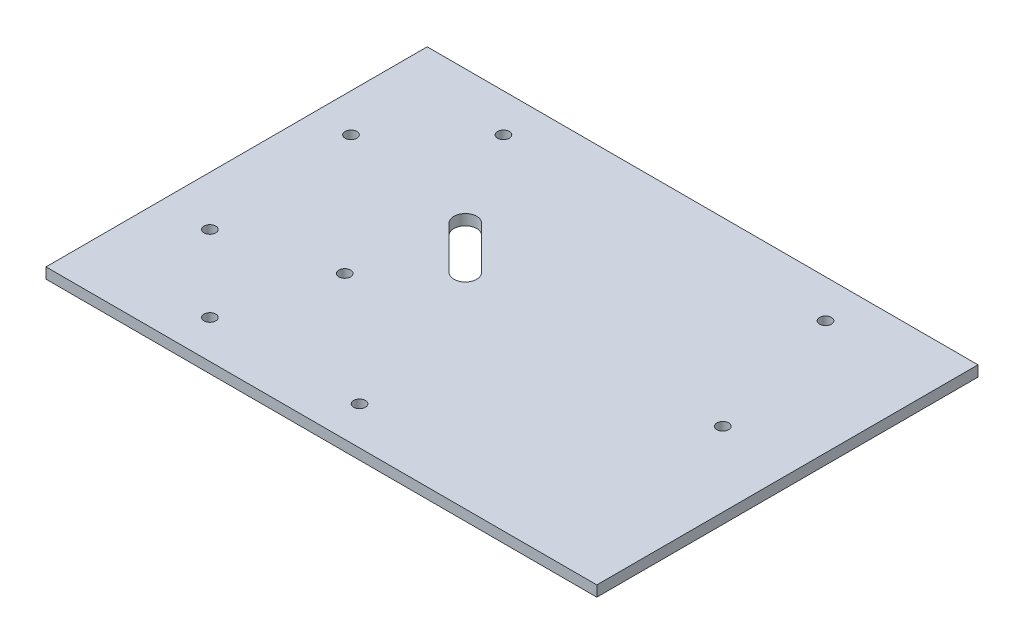
ISO-10303-21;
HEADER;
FILE_DESCRIPTION(('STEP AP214'),'2;1');
FILE_NAME('part.step','',(''),(''),'','','');
FILE_SCHEMA(('AUTOMOTIVE_DESIGN { 1 0 10303 214 1 1 1 1 }'));
ENDSEC;
DATA;
#1=APPLICATION_CONTEXT('core data for automotive mechanical design processes');
#2=APPLICATION_PROTOCOL_DEFINITION('international standard','automotive_design',2000,#1);
#3=PRODUCT_CONTEXT('',#1,'mechanical');
#4=PRODUCT('Part','Part','',(#3));
#5=PRODUCT_RELATED_PRODUCT_CATEGORY('part','',(#4));
#6=PRODUCT_DEFINITION_FORMATION('','',#4);
#7=PRODUCT_DEFINITION_CONTEXT('part definition',#1,'design');
#8=PRODUCT_DEFINITION('design','',#6,#7);
#9=PRODUCT_DEFINITION_SHAPE('','',#8);
#10=(LENGTH_UNIT() NAMED_UNIT(*) SI_UNIT(.MILLI.,.METRE.));
#11=(NAMED_UNIT(*) PLANE_ANGLE_UNIT() SI_UNIT($,.RADIAN.));
#12=(NAMED_UNIT(*) SI_UNIT($,.STERADIAN.) SOLID_ANGLE_UNIT());
#13=UNCERTAINTY_MEASURE_WITH_UNIT(LENGTH_MEASURE(1.E-05),#10,'distance_accuracy_value','');
#14=(GEOMETRIC_REPRESENTATION_CONTEXT(3) GLOBAL_UNCERTAINTY_ASSIGNED_CONTEXT((#13)) GLOBAL_UNIT_ASSIGNED_CONTEXT((#10,
#11,#12)) REPRESENTATION_CONTEXT('',''));
#15=CARTESIAN_POINT('',(0.,0.,0.));
#16=DIRECTION('',(0.,0.,1.));
#17=DIRECTION('',(1.,0.,0.));
#18=AXIS2_PLACEMENT_3D('',#15,#16,#17);
#19=CARTESIAN_POINT('',(0.,2.8,0.));
#20=DIRECTION('',(0.,-1.,0.));
#21=DIRECTION('',(0.,0.,-1.));
#22=AXIS2_PLACEMENT_3D('',#19,#20,#21);
#23=PLANE('',#22);
#24=CARTESIAN_POINT('',(52.75,2.8,-2.56000000000001));
#25=DIRECTION('',(0.,1.,0.));
#26=DIRECTION('',(0.,0.,1.));
#27=AXIS2_PLACEMENT_3D('',#24,#25,#26);
#28=CIRCLE('',#27,1.55);
#29=CARTESIAN_POINT('',(52.75,2.8,-1.01000000000001));
#30=VERTEX_POINT('',#29);
#31=EDGE_CURVE('E276',#30,#30,#28,.T.);
#32=ORIENTED_EDGE('',*,*,#31,.F.);
#33=EDGE_LOOP('',(#32));
#34=FACE_BOUND('',#33,.T.);
#35=CARTESIAN_POINT('',(-62.25,2.8,-20.));
#36=DIRECTION('',(0.,1.,0.));
#37=DIRECTION('',(0.,0.,1.));
#38=AXIS2_PLACEMENT_3D('',#35,#36,#37);
#39=CIRCLE('',#38,1.54999999999999);
#40=CARTESIAN_POINT('',(-62.25,2.8,-18.45));
#41=VERTEX_POINT('',#40);
#42=EDGE_CURVE('E284',#41,#41,#39,.T.);
#43=ORIENTED_EDGE('',*,*,#42,.F.);
#44=EDGE_LOOP('',(#43));
#45=FACE_BOUND('',#44,.T.);
#46=CARTESIAN_POINT('',(-42.25,2.8,-40.));
#47=DIRECTION('',(0.,1.,0.));
#48=DIRECTION('',(0.,0.,1.));
#49=AXIS2_PLACEMENT_3D('',#46,#47,#48);
#50=CIRCLE('',#49,1.55);
#51=CARTESIAN_POINT('',(-42.25,2.8,-38.45));
#52=VERTEX_POINT('',#51);
#53=EDGE_CURVE('E290',#52,#52,#50,.T.);
#54=ORIENTED_EDGE('',*,*,#53,.F.);
#55=EDGE_LOOP('',(#54));
#56=FACE_BOUND('',#55,.T.);
#57=CARTESIAN_POINT('',(42.25,2.8,-40.));
#58=DIRECTION('',(0.,1.,0.));
#59=DIRECTION('',(0.,0.,1.));
#60=AXIS2_PLACEMENT_3D('',#57,#58,#59);
#61=CIRCLE('',#60,1.55);
#62=CARTESIAN_POINT('',(42.25,2.8,-38.45));
#63=VERTEX_POINT('',#62);
#64=EDGE_CURVE('E296',#63,#63,#61,.T.);
#65=ORIENTED_EDGE('',*,*,#64,.F.);
#66=EDGE_LOOP('',(#65));
#67=FACE_BOUND('',#66,.T.);
#68=CARTESIAN_POINT('',(0.,2.8,40.));
#69=DIRECTION('',(0.,1.,0.));
#70=DIRECTION('',(0.,0.,1.));
#71=AXIS2_PLACEMENT_3D('',#68,#69,#70);
#72=CIRCLE('',#71,1.55);
#73=CARTESIAN_POINT('',(0.,2.8,41.55));
#74=VERTEX_POINT('',#73);
#75=EDGE_CURVE('E280',#74,#74,#72,.T.);
#76=ORIENTED_EDGE('',*,*,#75,.F.);
#77=EDGE_LOOP('',(#76));
#78=FACE_BOUND('',#77,.T.);
#79=DIRECTION('',(0.707106781186551,0.,0.707106781186544));
#80=VECTOR('',#79,1.);
#81=CARTESIAN_POINT('',(-29.3713203435596,2.8,-12.8786796564403));
#82=LINE('',#81,#80);
#83=CARTESIAN_POINT('',(-29.3713203435596,2.8,-12.8786796564403));
#84=VERTEX_POINT('',#83);
#85=CARTESIAN_POINT('',(-18.0576118445746,2.8,-1.56497115745581));
#86=VERTEX_POINT('',#85);
#87=EDGE_CURVE('E117',#84,#86,#82,.T.);
#88=ORIENTED_EDGE('',*,*,#87,.F.);
#89=CARTESIAN_POINT('',(-27.25,2.8,-15.));
#90=DIRECTION('',(0.,1.,0.));
#91=DIRECTION('',(0.,0.,1.));
#92=AXIS2_PLACEMENT_3D('',#89,#90,#91);
#93=CIRCLE('',#92,3.);
#94=CARTESIAN_POINT('',(-25.1286796564404,2.8,-17.1213203435596));
#95=VERTEX_POINT('',#94);
#96=EDGE_CURVE('E48',#95,#84,#93,.T.);
#97=ORIENTED_EDGE('',*,*,#96,.F.);
#98=DIRECTION('',(-0.707106781186551,0.,-0.707106781186544));
#99=VECTOR('',#98,1.);
#100=CARTESIAN_POINT('',(-25.1286796564404,2.8,-17.1213203435596));
#101=LINE('',#100,#99);
#102=CARTESIAN_POINT('',(-13.8149711574555,2.8,-5.80761184457495));
#103=VERTEX_POINT('',#102);
#104=EDGE_CURVE('E110',#103,#95,#101,.T.);
#105=ORIENTED_EDGE('',*,*,#104,.F.);
#106=CARTESIAN_POINT('',(-15.936291501015,2.8,-3.68629150101547));
#107=DIRECTION('',(0.,1.,0.));
#108=DIRECTION('',(0.,0.,1.));
#109=AXIS2_PLACEMENT_3D('',#106,#107,#108);
#110=CIRCLE('',#109,3.);
#111=EDGE_CURVE('E124',#86,#103,#110,.T.);
#112=ORIENTED_EDGE('',*,*,#111,.F.);
#113=EDGE_LOOP('',(#88,#97,#105,#112));
#114=FACE_BOUND('',#113,.T.);
#115=DIRECTION('',(0.,0.,-1.));
#116=VECTOR('',#115,1.);
#117=CARTESIAN_POINT('',(72.25,2.8,50.));
#118=LINE('',#117,#116);
#119=CARTESIAN_POINT('',(72.25,2.8,50.));
#120=VERTEX_POINT('',#119);
#121=CARTESIAN_POINT('',(72.25,2.8,-50.));
#122=VERTEX_POINT('',#121);
#123=EDGE_CURVE('E151',#120,#122,#118,.T.);
#124=ORIENTED_EDGE('',*,*,#123,.T.);
#125=DIRECTION('',(-1.,0.,0.));
#126=VECTOR('',#125,1.);
#127=CARTESIAN_POINT('',(-72.25,2.8,-50.));
#128=LINE('',#127,#126);
#129=CARTESIAN_POINT('',(-72.25,2.8,-50.));
#130=VERTEX_POINT('',#129);
#131=EDGE_CURVE('E154',#122,#130,#128,.T.);
#132=ORIENTED_EDGE('',*,*,#131,.T.);
#133=DIRECTION('',(0.,0.,1.));
#134=VECTOR('',#133,1.);
#135=CARTESIAN_POINT('',(-72.25,2.8,50.));
#136=LINE('',#135,#134);
#137=CARTESIAN_POINT('',(-72.25,2.8,50.));
#138=VERTEX_POINT('',#137);
#139=EDGE_CURVE('E157',#130,#138,#136,.T.);
#140=ORIENTED_EDGE('',*,*,#139,.T.);
#141=DIRECTION('',(1.,0.,0.));
#142=VECTOR('',#141,1.);
#143=CARTESIAN_POINT('',(-72.25,2.8,50.));
#144=LINE('',#143,#142);
#145=EDGE_CURVE('E159',#138,#120,#144,.T.);
#146=ORIENTED_EDGE('',*,*,#145,.T.);
#147=EDGE_LOOP('',(#124,#132,#140,#146));
#148=FACE_BOUND('',#147,.T.);
#149=CARTESIAN_POINT('',(-59.25,2.8,20.));
#150=DIRECTION('',(0.,1.,0.));
#151=DIRECTION('',(0.,0.,1.));
#152=AXIS2_PLACEMENT_3D('',#149,#150,#151);
#153=CIRCLE('',#152,1.55);
#154=CARTESIAN_POINT('',(-59.25,2.8,21.55));
#155=VERTEX_POINT('',#154);
#156=EDGE_CURVE('E145',#155,#155,#153,.T.);
#157=ORIENTED_EDGE('',*,*,#156,.F.);
#158=EDGE_LOOP('',(#157));
#159=FACE_BOUND('',#158,.T.);
#160=CARTESIAN_POINT('',(-39.25,2.8,40.));
#161=DIRECTION('',(0.,1.,0.));
#162=DIRECTION('',(0.,0.,1.));
#163=AXIS2_PLACEMENT_3D('',#160,#161,#162);
#164=CIRCLE('',#163,1.55);
#165=CARTESIAN_POINT('',(-39.25,2.8,41.55));
#166=VERTEX_POINT('',#165);
#167=EDGE_CURVE('E139',#166,#166,#164,.T.);
#168=ORIENTED_EDGE('',*,*,#167,.F.);
#169=EDGE_LOOP('',(#168));
#170=FACE_BOUND('',#169,.T.);
#171=CARTESIAN_POINT('',(-31.5723304703363,2.8,12.3223304703363));
#172=DIRECTION('',(0.,1.,0.));
#173=DIRECTION('',(0.,0.,1.));
#174=AXIS2_PLACEMENT_3D('',#171,#172,#173);
#175=CIRCLE('',#174,1.55);
#176=CARTESIAN_POINT('',(-31.5723304703363,2.8,13.8723304703363));
#177=VERTEX_POINT('',#176);
#178=EDGE_CURVE('E133',#177,#177,#175,.T.);
#179=ORIENTED_EDGE('',*,*,#178,.F.);
#180=EDGE_LOOP('',(#179));
#181=FACE_BOUND('',#180,.T.);
#182=ADVANCED_FACE('F33',(#34,#45,#56,#67,#78,#114,#148,#159,#170,#181),#23,.F.);
#183=CARTESIAN_POINT('',(0.,0.,0.));
#184=DIRECTION('',(0.,-1.,0.));
#185=DIRECTION('',(0.,0.,-1.));
#186=AXIS2_PLACEMENT_3D('',#183,#184,#185);
#187=PLANE('',#186);
#188=CARTESIAN_POINT('',(52.75,0.,-2.56000000000001));
#189=DIRECTION('',(0.,-1.,0.));
#190=DIRECTION('',(0.,0.,-1.));
#191=AXIS2_PLACEMENT_3D('',#188,#189,#190);
#192=CIRCLE('',#191,1.55);
#193=CARTESIAN_POINT('',(52.75,0.,-4.11000000000001));
#194=VERTEX_POINT('',#193);
#195=EDGE_CURVE('E274',#194,#194,#192,.F.);
#196=ORIENTED_EDGE('',*,*,#195,.T.);
#197=EDGE_LOOP('',(#196));
#198=FACE_BOUND('',#197,.T.);
#199=CARTESIAN_POINT('',(-62.25,0.,-20.));
#200=DIRECTION('',(0.,-1.,0.));
#201=DIRECTION('',(0.,0.,-1.));
#202=AXIS2_PLACEMENT_3D('',#199,#200,#201);
#203=CIRCLE('',#202,1.54999999999999);
#204=CARTESIAN_POINT('',(-62.25,0.,-21.55));
#205=VERTEX_POINT('',#204);
#206=EDGE_CURVE('E287',#205,#205,#203,.F.);
#207=ORIENTED_EDGE('',*,*,#206,.T.);
#208=EDGE_LOOP('',(#207));
#209=FACE_BOUND('',#208,.T.);
#210=CARTESIAN_POINT('',(-42.25,0.,-40.));
#211=DIRECTION('',(0.,-1.,0.));
#212=DIRECTION('',(0.,0.,-1.));
#213=AXIS2_PLACEMENT_3D('',#210,#211,#212);
#214=CIRCLE('',#213,1.55);
#215=CARTESIAN_POINT('',(-42.25,0.,-41.55));
#216=VERTEX_POINT('',#215);
#217=EDGE_CURVE('E293',#216,#216,#214,.F.);
#218=ORIENTED_EDGE('',*,*,#217,.T.);
#219=EDGE_LOOP('',(#218));
#220=FACE_BOUND('',#219,.T.);
#221=CARTESIAN_POINT('',(42.25,0.,-40.));
#222=DIRECTION('',(0.,-1.,0.));
#223=DIRECTION('',(0.,0.,-1.));
#224=AXIS2_PLACEMENT_3D('',#221,#222,#223);
#225=CIRCLE('',#224,1.55);
#226=CARTESIAN_POINT('',(42.25,0.,-41.55));
#227=VERTEX_POINT('',#226);
#228=EDGE_CURVE('E299',#227,#227,#225,.F.);
#229=ORIENTED_EDGE('',*,*,#228,.T.);
#230=EDGE_LOOP('',(#229));
#231=FACE_BOUND('',#230,.T.);
#232=CARTESIAN_POINT('',(0.,0.,40.));
#233=DIRECTION('',(0.,-1.,0.));
#234=DIRECTION('',(0.,0.,-1.));
#235=AXIS2_PLACEMENT_3D('',#232,#233,#234);
#236=CIRCLE('',#235,1.55);
#237=CARTESIAN_POINT('',(0.,0.,38.45));
#238=VERTEX_POINT('',#237);
#239=EDGE_CURVE('E277',#238,#238,#236,.F.);
#240=ORIENTED_EDGE('',*,*,#239,.T.);
#241=EDGE_LOOP('',(#240));
#242=FACE_BOUND('',#241,.T.);
#243=CARTESIAN_POINT('',(-27.25,0.,-15.));
#244=DIRECTION('',(0.,-1.,0.));
#245=DIRECTION('',(0.,0.,-1.));
#246=AXIS2_PLACEMENT_3D('',#243,#244,#245);
#247=CIRCLE('',#246,3.);
#248=CARTESIAN_POINT('',(-25.1286796564404,0.,-17.1213203435596));
#249=VERTEX_POINT('',#248);
#250=CARTESIAN_POINT('',(-29.3713203435596,0.,-12.8786796564403));
#251=VERTEX_POINT('',#250);
#252=EDGE_CURVE('E108',#249,#251,#247,.F.);
#253=ORIENTED_EDGE('',*,*,#252,.T.);
#254=DIRECTION('',(0.707106781186551,0.,0.707106781186544));
#255=VECTOR('',#254,1.);
#256=CARTESIAN_POINT('',(-29.3713203435596,0.,-12.8786796564403));
#257=LINE('',#256,#255);
#258=CARTESIAN_POINT('',(-18.057611844575,0.,-1.56497115745581));
#259=VERTEX_POINT('',#258);
#260=EDGE_CURVE('E97',#251,#259,#257,.T.);
#261=ORIENTED_EDGE('',*,*,#260,.T.);
#262=CARTESIAN_POINT('',(-15.936291501015,0.,-3.68629150101547));
#263=DIRECTION('',(0.,-1.,0.));
#264=DIRECTION('',(0.,0.,-1.));
#265=AXIS2_PLACEMENT_3D('',#262,#263,#264);
#266=CIRCLE('',#265,3.);
#267=CARTESIAN_POINT('',(-13.8149711574554,0.,-5.80761184457512));
#268=VERTEX_POINT('',#267);
#269=EDGE_CURVE('E119',#259,#268,#266,.F.);
#270=ORIENTED_EDGE('',*,*,#269,.T.);
#271=DIRECTION('',(-0.707106781186551,0.,-0.707106781186544));
#272=VECTOR('',#271,1.);
#273=CARTESIAN_POINT('',(-25.1286796564404,0.,-17.1213203435596));
#274=LINE('',#273,#272);
#275=EDGE_CURVE('E115',#268,#249,#274,.T.);
#276=ORIENTED_EDGE('',*,*,#275,.T.);
#277=EDGE_LOOP('',(#253,#261,#270,#276));
#278=FACE_BOUND('',#277,.T.);
#279=CARTESIAN_POINT('',(-39.25,0.,40.));
#280=DIRECTION('',(0.,1.,0.));
#281=DIRECTION('',(0.,0.,1.));
#282=AXIS2_PLACEMENT_3D('',#279,#280,#281);
#283=CIRCLE('',#282,1.55);
#284=CARTESIAN_POINT('',(-39.25,0.,41.55));
#285=VERTEX_POINT('',#284);
#286=EDGE_CURVE('E136',#285,#285,#283,.T.);
#287=ORIENTED_EDGE('',*,*,#286,.T.);
#288=EDGE_LOOP('',(#287));
#289=FACE_BOUND('',#288,.T.);
#290=DIRECTION('',(0.,0.,-1.));
#291=VECTOR('',#290,1.);
#292=CARTESIAN_POINT('',(72.25,0.,50.));
#293=LINE('',#292,#291);
#294=CARTESIAN_POINT('',(72.25,0.,50.));
#295=VERTEX_POINT('',#294);
#296=CARTESIAN_POINT('',(72.25,0.,-50.));
#297=VERTEX_POINT('',#296);
#298=EDGE_CURVE('E148',#295,#297,#293,.T.);
#299=ORIENTED_EDGE('',*,*,#298,.F.);
#300=DIRECTION('',(1.,0.,0.));
#301=VECTOR('',#300,1.);
#302=CARTESIAN_POINT('',(-72.25,0.,50.));
#303=LINE('',#302,#301);
#304=CARTESIAN_POINT('',(-72.25,0.,50.));
#305=VERTEX_POINT('',#304);
#306=EDGE_CURVE('E155',#305,#295,#303,.T.);
#307=ORIENTED_EDGE('',*,*,#306,.F.);
#308=DIRECTION('',(0.,0.,1.));
#309=VECTOR('',#308,1.);
#310=CARTESIAN_POINT('',(-72.25,0.,50.));
#311=LINE('',#310,#309);
#312=CARTESIAN_POINT('',(-72.25,0.,-50.));
#313=VERTEX_POINT('',#312);
#314=EDGE_CURVE('E166',#313,#305,#311,.T.);
#315=ORIENTED_EDGE('',*,*,#314,.F.);
#316=DIRECTION('',(-1.,0.,0.));
#317=VECTOR('',#316,1.);
#318=CARTESIAN_POINT('',(-72.25,0.,-50.));
#319=LINE('',#318,#317);
#320=EDGE_CURVE('E164',#297,#313,#319,.T.);
#321=ORIENTED_EDGE('',*,*,#320,.F.);
#322=EDGE_LOOP('',(#299,#307,#315,#321));
#323=FACE_BOUND('',#322,.T.);
#324=CARTESIAN_POINT('',(-59.25,0.,20.));
#325=DIRECTION('',(0.,1.,0.));
#326=DIRECTION('',(0.,0.,1.));
#327=AXIS2_PLACEMENT_3D('',#324,#325,#326);
#328=CIRCLE('',#327,1.55);
#329=CARTESIAN_POINT('',(-59.25,0.,21.55));
#330=VERTEX_POINT('',#329);
#331=EDGE_CURVE('E142',#330,#330,#328,.T.);
#332=ORIENTED_EDGE('',*,*,#331,.T.);
#333=EDGE_LOOP('',(#332));
#334=FACE_BOUND('',#333,.T.);
#335=CARTESIAN_POINT('',(-31.5723304703363,0.,12.3223304703363));
#336=DIRECTION('',(0.,1.,0.));
#337=DIRECTION('',(0.,0.,1.));
#338=AXIS2_PLACEMENT_3D('',#335,#336,#337);
#339=CIRCLE('',#338,1.55);
#340=CARTESIAN_POINT('',(-31.5723304703363,0.,13.8723304703363));
#341=VERTEX_POINT('',#340);
#342=EDGE_CURVE('E104',#341,#341,#339,.T.);
#343=ORIENTED_EDGE('',*,*,#342,.T.);
#344=EDGE_LOOP('',(#343));
#345=FACE_BOUND('',#344,.T.);
#346=ADVANCED_FACE('F113',(#198,#209,#220,#231,#242,#278,#289,#323,#334,#345),#187,.T.);
#347=CARTESIAN_POINT('',(72.25,2.8,50.));
#348=DIRECTION('',(-1.,0.,0.));
#349=DIRECTION('',(0.,0.,1.));
#350=AXIS2_PLACEMENT_3D('',#347,#348,#349);
#351=PLANE('',#350);
#352=ORIENTED_EDGE('',*,*,#298,.T.);
#353=DIRECTION('',(0.,-1.,0.));
#354=VECTOR('',#353,1.);
#355=CARTESIAN_POINT('',(72.25,2.8,-50.));
#356=LINE('',#355,#354);
#357=EDGE_CURVE('E11',#122,#297,#356,.T.);
#358=ORIENTED_EDGE('',*,*,#357,.F.);
#359=ORIENTED_EDGE('',*,*,#123,.F.);
#360=DIRECTION('',(0.,-1.,0.));
#361=VECTOR('',#360,1.);
#362=CARTESIAN_POINT('',(72.25,2.8,50.));
#363=LINE('',#362,#361);
#364=EDGE_CURVE('E161',#120,#295,#363,.T.);
#365=ORIENTED_EDGE('',*,*,#364,.T.);
#366=EDGE_LOOP('',(#352,#358,#359,#365));
#367=FACE_BOUND('',#366,.T.);
#368=ADVANCED_FACE('F35',(#367),#351,.F.);
#369=CARTESIAN_POINT('',(-72.25,2.8,-50.));
#370=DIRECTION('',(0.,0.,1.));
#371=DIRECTION('',(1.,0.,0.));
#372=AXIS2_PLACEMENT_3D('',#369,#370,#371);
#373=PLANE('',#372);
#374=ORIENTED_EDGE('',*,*,#320,.T.);
#375=DIRECTION('',(0.,-1.,0.));
#376=VECTOR('',#375,1.);
#377=CARTESIAN_POINT('',(-72.25,2.8,-50.));
#378=LINE('',#377,#376);
#379=EDGE_CURVE('E41',#130,#313,#378,.T.);
#380=ORIENTED_EDGE('',*,*,#379,.F.);
#381=ORIENTED_EDGE('',*,*,#131,.F.);
#382=ORIENTED_EDGE('',*,*,#357,.T.);
#383=EDGE_LOOP('',(#374,#380,#381,#382));
#384=FACE_BOUND('',#383,.T.);
#385=ADVANCED_FACE('F194',(#384),#373,.F.);
#386=CARTESIAN_POINT('',(-72.25,2.8,50.));
#387=DIRECTION('',(1.,0.,0.));
#388=DIRECTION('',(0.,0.,-1.));
#389=AXIS2_PLACEMENT_3D('',#386,#387,#388);
#390=PLANE('',#389);
#391=ORIENTED_EDGE('',*,*,#314,.T.);
#392=DIRECTION('',(0.,-1.,0.));
#393=VECTOR('',#392,1.);
#394=CARTESIAN_POINT('',(-72.25,2.8,50.));
#395=LINE('',#394,#393);
#396=EDGE_CURVE('E171',#138,#305,#395,.T.);
#397=ORIENTED_EDGE('',*,*,#396,.F.);
#398=ORIENTED_EDGE('',*,*,#139,.F.);
#399=ORIENTED_EDGE('',*,*,#379,.T.);
#400=EDGE_LOOP('',(#391,#397,#398,#399));
#401=FACE_BOUND('',#400,.T.);
#402=ADVANCED_FACE('F178',(#401),#390,.F.);
#403=CARTESIAN_POINT('',(-72.25,2.8,50.));
#404=DIRECTION('',(0.,0.,-1.));
#405=DIRECTION('',(-1.,0.,0.));
#406=AXIS2_PLACEMENT_3D('',#403,#404,#405);
#407=PLANE('',#406);
#408=ORIENTED_EDGE('',*,*,#306,.T.);
#409=ORIENTED_EDGE('',*,*,#364,.F.);
#410=ORIENTED_EDGE('',*,*,#145,.F.);
#411=ORIENTED_EDGE('',*,*,#396,.T.);
#412=EDGE_LOOP('',(#408,#409,#410,#411));
#413=FACE_BOUND('',#412,.T.);
#414=ADVANCED_FACE('F187',(#413),#407,.F.);
#415=CARTESIAN_POINT('',(-59.25,2.8,20.));
#416=DIRECTION('',(0.,-1.,0.));
#417=DIRECTION('',(0.,0.,-1.));
#418=AXIS2_PLACEMENT_3D('',#415,#416,#417);
#419=CYLINDRICAL_SURFACE('',#418,1.55);
#420=ORIENTED_EDGE('',*,*,#156,.T.);
#421=EDGE_LOOP('',(#420));
#422=FACE_BOUND('',#421,.T.);
#423=ORIENTED_EDGE('',*,*,#331,.F.);
#424=EDGE_LOOP('',(#423));
#425=FACE_BOUND('',#424,.T.);
#426=ADVANCED_FACE('F212',(#422,#425),#419,.F.);
#427=CARTESIAN_POINT('',(-39.25,2.8,40.));
#428=DIRECTION('',(0.,-1.,0.));
#429=DIRECTION('',(0.,0.,-1.));
#430=AXIS2_PLACEMENT_3D('',#427,#428,#429);
#431=CYLINDRICAL_SURFACE('',#430,1.55);
#432=ORIENTED_EDGE('',*,*,#167,.T.);
#433=EDGE_LOOP('',(#432));
#434=FACE_BOUND('',#433,.T.);
#435=ORIENTED_EDGE('',*,*,#286,.F.);
#436=EDGE_LOOP('',(#435));
#437=FACE_BOUND('',#436,.T.);
#438=ADVANCED_FACE('F219',(#434,#437),#431,.F.);
#439=CARTESIAN_POINT('',(-31.5723304703363,2.8,12.3223304703363));
#440=DIRECTION('',(0.,-1.,0.));
#441=DIRECTION('',(0.,0.,-1.));
#442=AXIS2_PLACEMENT_3D('',#439,#440,#441);
#443=CYLINDRICAL_SURFACE('',#442,1.55);
#444=ORIENTED_EDGE('',*,*,#178,.T.);
#445=EDGE_LOOP('',(#444));
#446=FACE_BOUND('',#445,.T.);
#447=ORIENTED_EDGE('',*,*,#342,.F.);
#448=EDGE_LOOP('',(#447));
#449=FACE_BOUND('',#448,.T.);
#450=ADVANCED_FACE('F224',(#446,#449),#443,.F.);
#451=CARTESIAN_POINT('',(-27.25,-0.00100000000000013,-15.));
#452=DIRECTION('',(0.,1.,0.));
#453=DIRECTION('',(0.,0.,1.));
#454=AXIS2_PLACEMENT_3D('',#451,#452,#453);
#455=CYLINDRICAL_SURFACE('',#454,3.);
#456=DIRECTION('',(0.,1.,0.));
#457=VECTOR('',#456,1.);
#458=CARTESIAN_POINT('',(-25.1286796564404,-0.00100000000000013,-17.1213203435596));
#459=LINE('',#458,#457);
#460=EDGE_CURVE('E105',#249,#95,#459,.T.);
#461=ORIENTED_EDGE('',*,*,#460,.T.);
#462=ORIENTED_EDGE('',*,*,#96,.T.);
#463=DIRECTION('',(0.,1.,0.));
#464=VECTOR('',#463,1.);
#465=CARTESIAN_POINT('',(-29.3713203435596,-0.00100000000000013,-12.8786796564403));
#466=LINE('',#465,#464);
#467=EDGE_CURVE('E99',#251,#84,#466,.T.);
#468=ORIENTED_EDGE('',*,*,#467,.F.);
#469=ORIENTED_EDGE('',*,*,#252,.F.);
#470=EDGE_LOOP('',(#461,#462,#468,#469));
#471=FACE_BOUND('',#470,.T.);
#472=ADVANCED_FACE('F107',(#471),#455,.F.);
#473=CARTESIAN_POINT('',(-25.1286796564404,-0.00100000000000013,-17.1213203435596));
#474=DIRECTION('',(0.707106781186544,0.,-0.707106781186551));
#475=DIRECTION('',(-0.707106781186551,0.,-0.707106781186544));
#476=AXIS2_PLACEMENT_3D('',#473,#474,#475);
#477=PLANE('',#476);
#478=DIRECTION('',(0.,1.,0.));
#479=VECTOR('',#478,1.);
#480=CARTESIAN_POINT('',(-13.8149711574555,-0.00100000000000013,-5.80761184457495));
#481=LINE('',#480,#479);
#482=EDGE_CURVE('E130',#268,#103,#481,.T.);
#483=ORIENTED_EDGE('',*,*,#482,.T.);
#484=ORIENTED_EDGE('',*,*,#104,.T.);
#485=ORIENTED_EDGE('',*,*,#460,.F.);
#486=ORIENTED_EDGE('',*,*,#275,.F.);
#487=EDGE_LOOP('',(#483,#484,#485,#486));
#488=FACE_BOUND('',#487,.T.);
#489=ADVANCED_FACE('F238',(#488),#477,.F.);
#490=CARTESIAN_POINT('',(-15.936291501015,-0.00100000000000013,-3.68629150101547));
#491=DIRECTION('',(0.,1.,0.));
#492=DIRECTION('',(0.,0.,1.));
#493=AXIS2_PLACEMENT_3D('',#490,#491,#492);
#494=CYLINDRICAL_SURFACE('',#493,3.);
#495=DIRECTION('',(0.,1.,0.));
#496=VECTOR('',#495,1.);
#497=CARTESIAN_POINT('',(-18.0576118445746,-0.00100000000000013,-1.56497115745581));
#498=LINE('',#497,#496);
#499=EDGE_CURVE('E56',#259,#86,#498,.T.);
#500=ORIENTED_EDGE('',*,*,#499,.T.);
#501=ORIENTED_EDGE('',*,*,#111,.T.);
#502=ORIENTED_EDGE('',*,*,#482,.F.);
#503=ORIENTED_EDGE('',*,*,#269,.F.);
#504=EDGE_LOOP('',(#500,#501,#502,#503));
#505=FACE_BOUND('',#504,.T.);
#506=ADVANCED_FACE('F244',(#505),#494,.F.);
#507=CARTESIAN_POINT('',(-29.3713203435596,-0.00100000000000013,-12.8786796564403));
#508=DIRECTION('',(-0.707106781186544,0.,0.707106781186551));
#509=DIRECTION('',(0.707106781186551,0.,0.707106781186544));
#510=AXIS2_PLACEMENT_3D('',#507,#508,#509);
#511=PLANE('',#510);
#512=ORIENTED_EDGE('',*,*,#467,.T.);
#513=ORIENTED_EDGE('',*,*,#87,.T.);
#514=ORIENTED_EDGE('',*,*,#499,.F.);
#515=ORIENTED_EDGE('',*,*,#260,.F.);
#516=EDGE_LOOP('',(#512,#513,#514,#515));
#517=FACE_BOUND('',#516,.T.);
#518=ADVANCED_FACE('F98',(#517),#511,.F.);
#519=CARTESIAN_POINT('',(0.,-0.00100000000000013,40.));
#520=DIRECTION('',(0.,1.,0.));
#521=DIRECTION('',(0.,0.,1.));
#522=AXIS2_PLACEMENT_3D('',#519,#520,#521);
#523=CYLINDRICAL_SURFACE('',#522,1.55);
#524=ORIENTED_EDGE('',*,*,#239,.F.);
#525=EDGE_LOOP('',(#524));
#526=FACE_BOUND('',#525,.T.);
#527=ORIENTED_EDGE('',*,*,#75,.T.);
#528=EDGE_LOOP('',(#527));
#529=FACE_BOUND('',#528,.T.);
#530=ADVANCED_FACE('F243',(#526,#529),#523,.F.);
#531=CARTESIAN_POINT('',(42.25,-0.00100000000000013,-40.));
#532=DIRECTION('',(0.,1.,0.));
#533=DIRECTION('',(0.,0.,1.));
#534=AXIS2_PLACEMENT_3D('',#531,#532,#533);
#535=CYLINDRICAL_SURFACE('',#534,1.55);
#536=ORIENTED_EDGE('',*,*,#228,.F.);
#537=EDGE_LOOP('',(#536));
#538=FACE_BOUND('',#537,.T.);
#539=ORIENTED_EDGE('',*,*,#64,.T.);
#540=EDGE_LOOP('',(#539));
#541=FACE_BOUND('',#540,.T.);
#542=ADVANCED_FACE('F253',(#538,#541),#535,.F.);
#543=CARTESIAN_POINT('',(-42.25,-0.00100000000000013,-40.));
#544=DIRECTION('',(0.,1.,0.));
#545=DIRECTION('',(0.,0.,1.));
#546=AXIS2_PLACEMENT_3D('',#543,#544,#545);
#547=CYLINDRICAL_SURFACE('',#546,1.55);
#548=ORIENTED_EDGE('',*,*,#217,.F.);
#549=EDGE_LOOP('',(#548));
#550=FACE_BOUND('',#549,.T.);
#551=ORIENTED_EDGE('',*,*,#53,.T.);
#552=EDGE_LOOP('',(#551));
#553=FACE_BOUND('',#552,.T.);
#554=ADVANCED_FACE('F257',(#550,#553),#547,.F.);
#555=CARTESIAN_POINT('',(-62.25,-0.00100000000000013,-20.));
#556=DIRECTION('',(0.,1.,0.));
#557=DIRECTION('',(0.,0.,1.));
#558=AXIS2_PLACEMENT_3D('',#555,#556,#557);
#559=CYLINDRICAL_SURFACE('',#558,1.54999999999999);
#560=ORIENTED_EDGE('',*,*,#206,.F.);
#561=EDGE_LOOP('',(#560));
#562=FACE_BOUND('',#561,.T.);
#563=ORIENTED_EDGE('',*,*,#42,.T.);
#564=EDGE_LOOP('',(#563));
#565=FACE_BOUND('',#564,.T.);
#566=ADVANCED_FACE('F261',(#562,#565),#559,.F.);
#567=CARTESIAN_POINT('',(52.75,-0.00100000000000013,-2.56000000000001));
#568=DIRECTION('',(0.,1.,0.));
#569=DIRECTION('',(0.,0.,1.));
#570=AXIS2_PLACEMENT_3D('',#567,#568,#569);
#571=CYLINDRICAL_SURFACE('',#570,1.55);
#572=ORIENTED_EDGE('',*,*,#195,.F.);
#573=EDGE_LOOP('',(#572));
#574=FACE_BOUND('',#573,.T.);
#575=ORIENTED_EDGE('',*,*,#31,.T.);
#576=EDGE_LOOP('',(#575));
#577=FACE_BOUND('',#576,.T.);
#578=ADVANCED_FACE('F265',(#574,#577),#571,.F.);
#579=CLOSED_SHELL('',(#182,#346,#368,#385,#402,#414,#426,#438,#450,#472,#489,#506,#518,#530,
#542,#554,#566,#578));
#580=MANIFOLD_SOLID_BREP('B2',#579);
#581=ADVANCED_BREP_SHAPE_REPRESENTATION('',(#18,#580),#14);
#582=SHAPE_DEFINITION_REPRESENTATION(#9,#581);
ENDSEC;
END-ISO-10303-21;
